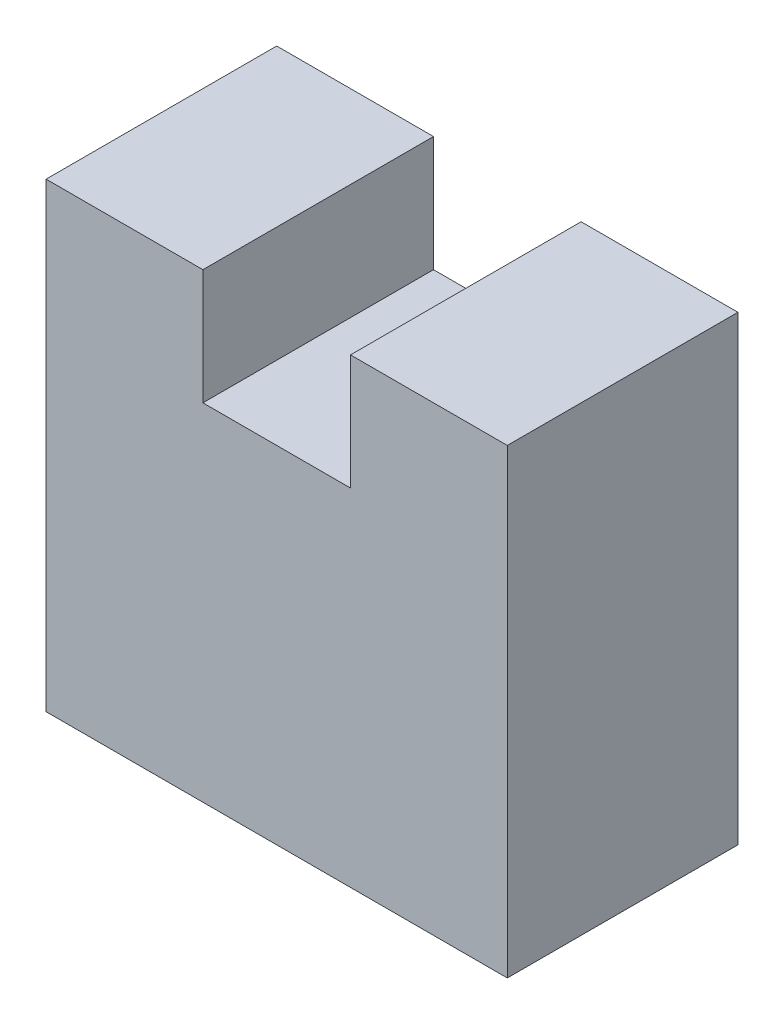
ISO-10303-21;
HEADER;
FILE_DESCRIPTION(('STEP AP214'),'2;1');
FILE_NAME('part.step','',(''),(''),'','','');
FILE_SCHEMA(('AUTOMOTIVE_DESIGN { 1 0 10303 214 1 1 1 1 }'));
ENDSEC;
DATA;
#1=APPLICATION_CONTEXT('core data for automotive mechanical design processes');
#2=APPLICATION_PROTOCOL_DEFINITION('international standard','automotive_design',2000,#1);
#3=PRODUCT_CONTEXT('',#1,'mechanical');
#4=PRODUCT('Part','Part','',(#3));
#5=PRODUCT_RELATED_PRODUCT_CATEGORY('part','',(#4));
#6=PRODUCT_DEFINITION_FORMATION('','',#4);
#7=PRODUCT_DEFINITION_CONTEXT('part definition',#1,'design');
#8=PRODUCT_DEFINITION('design','',#6,#7);
#9=PRODUCT_DEFINITION_SHAPE('','',#8);
#10=(LENGTH_UNIT() NAMED_UNIT(*) SI_UNIT(.MILLI.,.METRE.));
#11=(NAMED_UNIT(*) PLANE_ANGLE_UNIT() SI_UNIT($,.RADIAN.));
#12=(NAMED_UNIT(*) SI_UNIT($,.STERADIAN.) SOLID_ANGLE_UNIT());
#13=UNCERTAINTY_MEASURE_WITH_UNIT(LENGTH_MEASURE(1.E-05),#10,'distance_accuracy_value','');
#14=(GEOMETRIC_REPRESENTATION_CONTEXT(3) GLOBAL_UNCERTAINTY_ASSIGNED_CONTEXT((#13)) GLOBAL_UNIT_ASSIGNED_CONTEXT((#10,
#11,#12)) REPRESENTATION_CONTEXT('',''));
#15=CARTESIAN_POINT('',(0.,0.,0.));
#16=DIRECTION('',(0.,0.,1.));
#17=DIRECTION('',(1.,0.,0.));
#18=AXIS2_PLACEMENT_3D('',#15,#16,#17);
#19=CARTESIAN_POINT('',(-9.99999999999999,10.,10.));
#20=DIRECTION('',(0.,-1.,0.));
#21=DIRECTION('',(0.,0.,-1.));
#22=AXIS2_PLACEMENT_3D('',#19,#20,#21);
#23=PLANE('',#22);
#24=DIRECTION('',(-1.,0.,0.));
#25=VECTOR('',#24,1.);
#26=CARTESIAN_POINT('',(-9.99999999999999,10.,0.));
#27=LINE('',#26,#25);
#28=CARTESIAN_POINT('',(10.,10.,0.));
#29=VERTEX_POINT('',#28);
#30=CARTESIAN_POINT('',(3.2,10.,0.));
#31=VERTEX_POINT('',#30);
#32=EDGE_CURVE('E141',#29,#31,#27,.T.);
#33=ORIENTED_EDGE('',*,*,#32,.T.);
#34=DIRECTION('',(0.,0.,1.));
#35=VECTOR('',#34,1.);
#36=CARTESIAN_POINT('',(3.2,10.,0.));
#37=LINE('',#36,#35);
#38=CARTESIAN_POINT('',(3.2,10.,10.));
#39=VERTEX_POINT('',#38);
#40=EDGE_CURVE('E146',#31,#39,#37,.T.);
#41=ORIENTED_EDGE('',*,*,#40,.T.);
#42=DIRECTION('',(-1.,0.,0.));
#43=VECTOR('',#42,1.);
#44=CARTESIAN_POINT('',(-9.99999999999999,10.,10.));
#45=LINE('',#44,#43);
#46=CARTESIAN_POINT('',(10.,10.,10.));
#47=VERTEX_POINT('',#46);
#48=EDGE_CURVE('E95',#47,#39,#45,.T.);
#49=ORIENTED_EDGE('',*,*,#48,.F.);
#50=DIRECTION('',(0.,0.,-1.));
#51=VECTOR('',#50,1.);
#52=CARTESIAN_POINT('',(10.,10.,10.));
#53=LINE('',#52,#51);
#54=EDGE_CURVE('E11',#47,#29,#53,.T.);
#55=ORIENTED_EDGE('',*,*,#54,.T.);
#56=EDGE_LOOP('',(#33,#41,#49,#55));
#57=FACE_BOUND('',#56,.T.);
#58=ADVANCED_FACE('F43',(#57),#23,.F.);
#59=CARTESIAN_POINT('',(10.,-10.,10.));
#60=DIRECTION('',(-1.,0.,0.));
#61=DIRECTION('',(0.,0.,1.));
#62=AXIS2_PLACEMENT_3D('',#59,#60,#61);
#63=PLANE('',#62);
#64=DIRECTION('',(0.,1.,0.));
#65=VECTOR('',#64,1.);
#66=CARTESIAN_POINT('',(10.,-10.,0.));
#67=LINE('',#66,#65);
#68=CARTESIAN_POINT('',(10.,-10.,0.));
#69=VERTEX_POINT('',#68);
#70=EDGE_CURVE('E142',#69,#29,#67,.T.);
#71=ORIENTED_EDGE('',*,*,#70,.T.);
#72=ORIENTED_EDGE('',*,*,#54,.F.);
#73=DIRECTION('',(0.,1.,0.));
#74=VECTOR('',#73,1.);
#75=CARTESIAN_POINT('',(10.,-10.,10.));
#76=LINE('',#75,#74);
#77=CARTESIAN_POINT('',(10.,-10.,10.));
#78=VERTEX_POINT('',#77);
#79=EDGE_CURVE('E152',#78,#47,#76,.T.);
#80=ORIENTED_EDGE('',*,*,#79,.F.);
#81=DIRECTION('',(0.,0.,-1.));
#82=VECTOR('',#81,1.);
#83=CARTESIAN_POINT('',(10.,-10.,10.));
#84=LINE('',#83,#82);
#85=EDGE_CURVE('E153',#78,#69,#84,.T.);
#86=ORIENTED_EDGE('',*,*,#85,.T.);
#87=EDGE_LOOP('',(#71,#72,#80,#86));
#88=FACE_BOUND('',#87,.T.);
#89=ADVANCED_FACE('F45',(#88),#63,.F.);
#90=CARTESIAN_POINT('',(-3.2,10.,10.));
#91=VERTEX_POINT('',#90);
#92=CARTESIAN_POINT('',(-9.99999999999999,10.,10.));
#93=VERTEX_POINT('',#92);
#94=EDGE_CURVE('E134',#91,#93,#45,.T.);
#95=ORIENTED_EDGE('',*,*,#94,.F.);
#96=DIRECTION('',(0.,0.,1.));
#97=VECTOR('',#96,1.);
#98=CARTESIAN_POINT('',(-3.2,10.,0.));
#99=LINE('',#98,#97);
#100=CARTESIAN_POINT('',(-3.2,10.,0.));
#101=VERTEX_POINT('',#100);
#102=EDGE_CURVE('E121',#101,#91,#99,.T.);
#103=ORIENTED_EDGE('',*,*,#102,.F.);
#104=CARTESIAN_POINT('',(-9.99999999999999,10.,0.));
#105=VERTEX_POINT('',#104);
#106=EDGE_CURVE('E132',#101,#105,#27,.T.);
#107=ORIENTED_EDGE('',*,*,#106,.T.);
#108=DIRECTION('',(0.,0.,-1.));
#109=VECTOR('',#108,1.);
#110=CARTESIAN_POINT('',(-9.99999999999999,10.,10.));
#111=LINE('',#110,#109);
#112=EDGE_CURVE('E51',#93,#105,#111,.T.);
#113=ORIENTED_EDGE('',*,*,#112,.F.);
#114=EDGE_LOOP('',(#95,#103,#107,#113));
#115=FACE_BOUND('',#114,.T.);
#116=ADVANCED_FACE('F130',(#115),#23,.F.);
#117=CARTESIAN_POINT('',(-9.99999999999999,-10.,10.));
#118=DIRECTION('',(1.,0.,0.));
#119=DIRECTION('',(0.,0.,-1.));
#120=AXIS2_PLACEMENT_3D('',#117,#118,#119);
#121=PLANE('',#120);
#122=DIRECTION('',(0.,-1.,0.));
#123=VECTOR('',#122,1.);
#124=CARTESIAN_POINT('',(-9.99999999999999,-10.,0.));
#125=LINE('',#124,#123);
#126=CARTESIAN_POINT('',(-9.99999999999999,-10.,0.));
#127=VERTEX_POINT('',#126);
#128=EDGE_CURVE('E140',#105,#127,#125,.T.);
#129=ORIENTED_EDGE('',*,*,#128,.T.);
#130=DIRECTION('',(0.,0.,-1.));
#131=VECTOR('',#130,1.);
#132=CARTESIAN_POINT('',(-9.99999999999999,-10.,10.));
#133=LINE('',#132,#131);
#134=CARTESIAN_POINT('',(-9.99999999999999,-10.,10.));
#135=VERTEX_POINT('',#134);
#136=EDGE_CURVE('E155',#135,#127,#133,.T.);
#137=ORIENTED_EDGE('',*,*,#136,.F.);
#138=DIRECTION('',(0.,-1.,0.));
#139=VECTOR('',#138,1.);
#140=CARTESIAN_POINT('',(-9.99999999999999,-10.,10.));
#141=LINE('',#140,#139);
#142=EDGE_CURVE('E160',#93,#135,#141,.T.);
#143=ORIENTED_EDGE('',*,*,#142,.F.);
#144=ORIENTED_EDGE('',*,*,#112,.T.);
#145=EDGE_LOOP('',(#129,#137,#143,#144));
#146=FACE_BOUND('',#145,.T.);
#147=ADVANCED_FACE('F158',(#146),#121,.F.);
#148=CARTESIAN_POINT('',(-9.99999999999999,-10.,10.));
#149=DIRECTION('',(0.,1.,0.));
#150=DIRECTION('',(0.,0.,1.));
#151=AXIS2_PLACEMENT_3D('',#148,#149,#150);
#152=PLANE('',#151);
#153=DIRECTION('',(1.,0.,0.));
#154=VECTOR('',#153,1.);
#155=CARTESIAN_POINT('',(-9.99999999999999,-10.,0.));
#156=LINE('',#155,#154);
#157=EDGE_CURVE('E88',#127,#69,#156,.T.);
#158=ORIENTED_EDGE('',*,*,#157,.T.);
#159=ORIENTED_EDGE('',*,*,#85,.F.);
#160=DIRECTION('',(1.,0.,0.));
#161=VECTOR('',#160,1.);
#162=CARTESIAN_POINT('',(-9.99999999999999,-10.,10.));
#163=LINE('',#162,#161);
#164=EDGE_CURVE('E67',#135,#78,#163,.T.);
#165=ORIENTED_EDGE('',*,*,#164,.F.);
#166=ORIENTED_EDGE('',*,*,#136,.T.);
#167=EDGE_LOOP('',(#158,#159,#165,#166));
#168=FACE_BOUND('',#167,.T.);
#169=ADVANCED_FACE('F182',(#168),#152,.F.);
#170=CARTESIAN_POINT('',(0.,0.,10.));
#171=DIRECTION('',(0.,0.,-1.));
#172=DIRECTION('',(-1.,0.,0.));
#173=AXIS2_PLACEMENT_3D('',#170,#171,#172);
#174=PLANE('',#173);
#175=ORIENTED_EDGE('',*,*,#48,.T.);
#176=DIRECTION('',(0.,1.,0.));
#177=VECTOR('',#176,1.);
#178=CARTESIAN_POINT('',(3.2,10.,10.));
#179=LINE('',#178,#177);
#180=CARTESIAN_POINT('',(3.2,5.00000000000001,10.));
#181=VERTEX_POINT('',#180);
#182=EDGE_CURVE('E126',#181,#39,#179,.T.);
#183=ORIENTED_EDGE('',*,*,#182,.F.);
#184=DIRECTION('',(1.,0.,0.));
#185=VECTOR('',#184,1.);
#186=CARTESIAN_POINT('',(3.2,5.00000000000001,10.));
#187=LINE('',#186,#185);
#188=CARTESIAN_POINT('',(-3.2,5.00000000000001,10.));
#189=VERTEX_POINT('',#188);
#190=EDGE_CURVE('E170',#189,#181,#187,.T.);
#191=ORIENTED_EDGE('',*,*,#190,.F.);
#192=DIRECTION('',(0.,-1.,0.));
#193=VECTOR('',#192,1.);
#194=CARTESIAN_POINT('',(-3.2,5.00000000000001,10.));
#195=LINE('',#194,#193);
#196=EDGE_CURVE('E173',#91,#189,#195,.T.);
#197=ORIENTED_EDGE('',*,*,#196,.F.);
#198=ORIENTED_EDGE('',*,*,#94,.T.);
#199=ORIENTED_EDGE('',*,*,#142,.T.);
#200=ORIENTED_EDGE('',*,*,#164,.T.);
#201=ORIENTED_EDGE('',*,*,#79,.T.);
#202=EDGE_LOOP('',(#175,#183,#191,#197,#198,#199,#200,#201));
#203=FACE_BOUND('',#202,.T.);
#204=ADVANCED_FACE('F184',(#203),#174,.F.);
#205=CARTESIAN_POINT('',(0.,0.,0.));
#206=DIRECTION('',(0.,0.,-1.));
#207=DIRECTION('',(-1.,0.,0.));
#208=AXIS2_PLACEMENT_3D('',#205,#206,#207);
#209=PLANE('',#208);
#210=DIRECTION('',(0.,1.,0.));
#211=VECTOR('',#210,1.);
#212=CARTESIAN_POINT('',(3.2,10.,0.));
#213=LINE('',#212,#211);
#214=CARTESIAN_POINT('',(3.2,5.00000000000001,0.));
#215=VERTEX_POINT('',#214);
#216=EDGE_CURVE('E135',#215,#31,#213,.T.);
#217=ORIENTED_EDGE('',*,*,#216,.T.);
#218=ORIENTED_EDGE('',*,*,#32,.F.);
#219=ORIENTED_EDGE('',*,*,#70,.F.);
#220=ORIENTED_EDGE('',*,*,#157,.F.);
#221=ORIENTED_EDGE('',*,*,#128,.F.);
#222=ORIENTED_EDGE('',*,*,#106,.F.);
#223=DIRECTION('',(0.,-1.,0.));
#224=VECTOR('',#223,1.);
#225=CARTESIAN_POINT('',(-3.2,5.00000000000001,0.));
#226=LINE('',#225,#224);
#227=CARTESIAN_POINT('',(-3.2,5.00000000000001,0.));
#228=VERTEX_POINT('',#227);
#229=EDGE_CURVE('E117',#101,#228,#226,.T.);
#230=ORIENTED_EDGE('',*,*,#229,.T.);
#231=DIRECTION('',(1.,0.,0.));
#232=VECTOR('',#231,1.);
#233=CARTESIAN_POINT('',(3.2,5.00000000000001,0.));
#234=LINE('',#233,#232);
#235=EDGE_CURVE('E58',#228,#215,#234,.T.);
#236=ORIENTED_EDGE('',*,*,#235,.T.);
#237=EDGE_LOOP('',(#217,#218,#219,#220,#221,#222,#230,#236));
#238=FACE_BOUND('',#237,.T.);
#239=ADVANCED_FACE('F139',(#238),#209,.T.);
#240=CARTESIAN_POINT('',(3.2,10.,0.));
#241=DIRECTION('',(1.,0.,0.));
#242=DIRECTION('',(0.,1.,0.));
#243=AXIS2_PLACEMENT_3D('',#240,#241,#242);
#244=PLANE('',#243);
#245=ORIENTED_EDGE('',*,*,#182,.T.);
#246=ORIENTED_EDGE('',*,*,#40,.F.);
#247=ORIENTED_EDGE('',*,*,#216,.F.);
#248=DIRECTION('',(0.,0.,1.));
#249=VECTOR('',#248,1.);
#250=CARTESIAN_POINT('',(3.2,5.00000000000001,0.));
#251=LINE('',#250,#249);
#252=EDGE_CURVE('E166',#215,#181,#251,.T.);
#253=ORIENTED_EDGE('',*,*,#252,.T.);
#254=EDGE_LOOP('',(#245,#246,#247,#253));
#255=FACE_BOUND('',#254,.T.);
#256=ADVANCED_FACE('F214',(#255),#244,.F.);
#257=CARTESIAN_POINT('',(3.2,5.00000000000001,0.));
#258=DIRECTION('',(0.,-1.,0.));
#259=DIRECTION('',(0.,0.,-1.));
#260=AXIS2_PLACEMENT_3D('',#257,#258,#259);
#261=PLANE('',#260);
#262=ORIENTED_EDGE('',*,*,#190,.T.);
#263=ORIENTED_EDGE('',*,*,#252,.F.);
#264=ORIENTED_EDGE('',*,*,#235,.F.);
#265=DIRECTION('',(0.,0.,1.));
#266=VECTOR('',#265,1.);
#267=CARTESIAN_POINT('',(-3.2,5.00000000000001,0.));
#268=LINE('',#267,#266);
#269=EDGE_CURVE('E123',#228,#189,#268,.T.);
#270=ORIENTED_EDGE('',*,*,#269,.T.);
#271=EDGE_LOOP('',(#262,#263,#264,#270));
#272=FACE_BOUND('',#271,.T.);
#273=ADVANCED_FACE('F222',(#272),#261,.F.);
#274=CARTESIAN_POINT('',(-3.2,5.00000000000001,0.));
#275=DIRECTION('',(-1.,0.,0.));
#276=DIRECTION('',(0.,0.,1.));
#277=AXIS2_PLACEMENT_3D('',#274,#275,#276);
#278=PLANE('',#277);
#279=ORIENTED_EDGE('',*,*,#196,.T.);
#280=ORIENTED_EDGE('',*,*,#269,.F.);
#281=ORIENTED_EDGE('',*,*,#229,.F.);
#282=ORIENTED_EDGE('',*,*,#102,.T.);
#283=EDGE_LOOP('',(#279,#280,#281,#282));
#284=FACE_BOUND('',#283,.T.);
#285=ADVANCED_FACE('F120',(#284),#278,.F.);
#286=CLOSED_SHELL('',(#58,#89,#116,#147,#169,#204,#239,#256,#273,#285));
#287=MANIFOLD_SOLID_BREP('B2',#286);
#288=ADVANCED_BREP_SHAPE_REPRESENTATION('',(#18,#287),#14);
#289=SHAPE_DEFINITION_REPRESENTATION(#9,#288);
ENDSEC;
END-ISO-10303-21;
